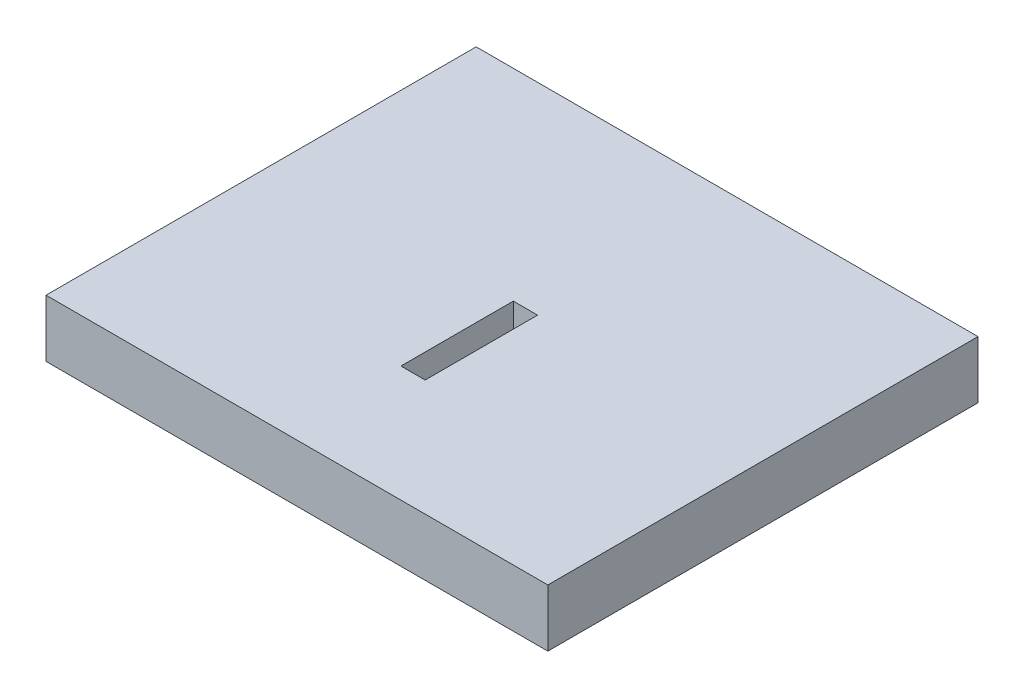
ISO-10303-21;
HEADER;
FILE_DESCRIPTION(('STEP AP214'),'2;1');
FILE_NAME('part.step','',(''),(''),'','','');
FILE_SCHEMA(('AUTOMOTIVE_DESIGN { 1 0 10303 214 1 1 1 1 }'));
ENDSEC;
DATA;
#1=APPLICATION_CONTEXT('core data for automotive mechanical design processes');
#2=APPLICATION_PROTOCOL_DEFINITION('international standard','automotive_design',2000,#1);
#3=PRODUCT_CONTEXT('',#1,'mechanical');
#4=PRODUCT('Part','Part','',(#3));
#5=PRODUCT_RELATED_PRODUCT_CATEGORY('part','',(#4));
#6=PRODUCT_DEFINITION_FORMATION('','',#4);
#7=PRODUCT_DEFINITION_CONTEXT('part definition',#1,'design');
#8=PRODUCT_DEFINITION('design','',#6,#7);
#9=PRODUCT_DEFINITION_SHAPE('','',#8);
#10=(LENGTH_UNIT() NAMED_UNIT(*) SI_UNIT(.MILLI.,.METRE.));
#11=(NAMED_UNIT(*) PLANE_ANGLE_UNIT() SI_UNIT($,.RADIAN.));
#12=(NAMED_UNIT(*) SI_UNIT($,.STERADIAN.) SOLID_ANGLE_UNIT());
#13=UNCERTAINTY_MEASURE_WITH_UNIT(LENGTH_MEASURE(1.E-05),#10,'distance_accuracy_value','');
#14=(GEOMETRIC_REPRESENTATION_CONTEXT(3) GLOBAL_UNCERTAINTY_ASSIGNED_CONTEXT((#13)) GLOBAL_UNIT_ASSIGNED_CONTEXT((#10,
#11,#12)) REPRESENTATION_CONTEXT('',''));
#15=CARTESIAN_POINT('',(0.,0.,0.));
#16=DIRECTION('',(0.,0.,1.));
#17=DIRECTION('',(1.,0.,0.));
#18=AXIS2_PLACEMENT_3D('',#15,#16,#17);
#19=CARTESIAN_POINT('',(0.,4.,0.));
#20=DIRECTION('',(0.,1.,0.));
#21=DIRECTION('',(0.,0.,1.));
#22=AXIS2_PLACEMENT_3D('',#19,#20,#21);
#23=PLANE('',#22);
#24=DIRECTION('',(0.,0.,1.));
#25=VECTOR('',#24,1.);
#26=CARTESIAN_POINT('',(0.,4.,0.));
#27=LINE('',#26,#25);
#28=CARTESIAN_POINT('',(0.,4.,0.));
#29=VERTEX_POINT('',#28);
#30=CARTESIAN_POINT('',(0.,4.,30.));
#31=VERTEX_POINT('',#30);
#32=EDGE_CURVE('E134',#29,#31,#27,.T.);
#33=ORIENTED_EDGE('',*,*,#32,.T.);
#34=DIRECTION('',(1.,0.,0.));
#35=VECTOR('',#34,1.);
#36=CARTESIAN_POINT('',(0.,4.,30.));
#37=LINE('',#36,#35);
#38=CARTESIAN_POINT('',(35.,4.,30.));
#39=VERTEX_POINT('',#38);
#40=EDGE_CURVE('E137',#31,#39,#37,.T.);
#41=ORIENTED_EDGE('',*,*,#40,.T.);
#42=DIRECTION('',(0.,0.,-1.));
#43=VECTOR('',#42,1.);
#44=CARTESIAN_POINT('',(35.,4.,0.));
#45=LINE('',#44,#43);
#46=CARTESIAN_POINT('',(35.,4.,0.));
#47=VERTEX_POINT('',#46);
#48=EDGE_CURVE('E140',#39,#47,#45,.T.);
#49=ORIENTED_EDGE('',*,*,#48,.T.);
#50=DIRECTION('',(-1.,0.,0.));
#51=VECTOR('',#50,1.);
#52=CARTESIAN_POINT('',(0.,4.,0.));
#53=LINE('',#52,#51);
#54=EDGE_CURVE('E142',#47,#29,#53,.T.);
#55=ORIENTED_EDGE('',*,*,#54,.T.);
#56=EDGE_LOOP('',(#33,#41,#49,#55));
#57=FACE_BOUND('',#56,.T.);
#58=DIRECTION('',(-1.,0.,0.));
#59=VECTOR('',#58,1.);
#60=CARTESIAN_POINT('',(16.6540479825426,4.,14.0626183458465));
#61=LINE('',#60,#59);
#62=CARTESIAN_POINT('',(18.3459520174574,4.,14.0626183458465));
#63=VERTEX_POINT('',#62);
#64=CARTESIAN_POINT('',(16.6540479825426,4.,14.0626183458465));
#65=VERTEX_POINT('',#64);
#66=EDGE_CURVE('E106',#63,#65,#61,.T.);
#67=ORIENTED_EDGE('',*,*,#66,.F.);
#68=DIRECTION('',(0.,0.,-1.));
#69=VECTOR('',#68,1.);
#70=CARTESIAN_POINT('',(18.3459520174574,4.,14.0626183458465));
#71=LINE('',#70,#69);
#72=CARTESIAN_POINT('',(18.3459520174574,4.,21.9021994151636));
#73=VERTEX_POINT('',#72);
#74=EDGE_CURVE('E98',#73,#63,#71,.T.);
#75=ORIENTED_EDGE('',*,*,#74,.F.);
#76=DIRECTION('',(1.,0.,0.));
#77=VECTOR('',#76,1.);
#78=CARTESIAN_POINT('',(16.6540479825426,4.,21.9021994151636));
#79=LINE('',#78,#77);
#80=CARTESIAN_POINT('',(16.6540479825426,4.,21.9021994151636));
#81=VERTEX_POINT('',#80);
#82=EDGE_CURVE('E120',#81,#73,#79,.T.);
#83=ORIENTED_EDGE('',*,*,#82,.F.);
#84=DIRECTION('',(0.,0.,1.));
#85=VECTOR('',#84,1.);
#86=CARTESIAN_POINT('',(16.6540479825426,4.,14.0626183458465));
#87=LINE('',#86,#85);
#88=EDGE_CURVE('E118',#65,#81,#87,.T.);
#89=ORIENTED_EDGE('',*,*,#88,.F.);
#90=EDGE_LOOP('',(#67,#75,#83,#89));
#91=FACE_BOUND('',#90,.T.);
#92=ADVANCED_FACE('F33',(#57,#91),#23,.T.);
#93=CARTESIAN_POINT('',(0.,0.,0.));
#94=DIRECTION('',(0.,1.,0.));
#95=DIRECTION('',(0.,0.,1.));
#96=AXIS2_PLACEMENT_3D('',#93,#94,#95);
#97=PLANE('',#96);
#98=DIRECTION('',(0.,0.,1.));
#99=VECTOR('',#98,1.);
#100=CARTESIAN_POINT('',(0.,0.,0.));
#101=LINE('',#100,#99);
#102=CARTESIAN_POINT('',(0.,0.,0.));
#103=VERTEX_POINT('',#102);
#104=CARTESIAN_POINT('',(0.,0.,30.));
#105=VERTEX_POINT('',#104);
#106=EDGE_CURVE('E114',#103,#105,#101,.T.);
#107=ORIENTED_EDGE('',*,*,#106,.F.);
#108=DIRECTION('',(-1.,0.,0.));
#109=VECTOR('',#108,1.);
#110=CARTESIAN_POINT('',(0.,0.,0.));
#111=LINE('',#110,#109);
#112=CARTESIAN_POINT('',(35.,0.,0.));
#113=VERTEX_POINT('',#112);
#114=EDGE_CURVE('E138',#113,#103,#111,.T.);
#115=ORIENTED_EDGE('',*,*,#114,.F.);
#116=DIRECTION('',(0.,0.,-1.));
#117=VECTOR('',#116,1.);
#118=CARTESIAN_POINT('',(35.,0.,0.));
#119=LINE('',#118,#117);
#120=CARTESIAN_POINT('',(35.,0.,30.));
#121=VERTEX_POINT('',#120);
#122=EDGE_CURVE('E149',#121,#113,#119,.T.);
#123=ORIENTED_EDGE('',*,*,#122,.F.);
#124=DIRECTION('',(1.,0.,0.));
#125=VECTOR('',#124,1.);
#126=CARTESIAN_POINT('',(0.,0.,30.));
#127=LINE('',#126,#125);
#128=EDGE_CURVE('E147',#105,#121,#127,.T.);
#129=ORIENTED_EDGE('',*,*,#128,.F.);
#130=EDGE_LOOP('',(#107,#115,#123,#129));
#131=FACE_BOUND('',#130,.T.);
#132=DIRECTION('',(0.,0.,-1.));
#133=VECTOR('',#132,1.);
#134=CARTESIAN_POINT('',(18.3459520174574,0.,14.0626183458465));
#135=LINE('',#134,#133);
#136=CARTESIAN_POINT('',(18.3459520174574,0.,21.9021994151636));
#137=VERTEX_POINT('',#136);
#138=CARTESIAN_POINT('',(18.3459520174574,0.,14.0626183458465));
#139=VERTEX_POINT('',#138);
#140=EDGE_CURVE('E56',#137,#139,#135,.T.);
#141=ORIENTED_EDGE('',*,*,#140,.T.);
#142=DIRECTION('',(-1.,0.,0.));
#143=VECTOR('',#142,1.);
#144=CARTESIAN_POINT('',(16.6540479825426,0.,14.0626183458465));
#145=LINE('',#144,#143);
#146=CARTESIAN_POINT('',(16.6540479825426,0.,14.0626183458465));
#147=VERTEX_POINT('',#146);
#148=EDGE_CURVE('E113',#139,#147,#145,.T.);
#149=ORIENTED_EDGE('',*,*,#148,.T.);
#150=DIRECTION('',(0.,0.,1.));
#151=VECTOR('',#150,1.);
#152=CARTESIAN_POINT('',(16.6540479825426,0.,14.0626183458465));
#153=LINE('',#152,#151);
#154=CARTESIAN_POINT('',(16.6540479825426,0.,21.9021994151636));
#155=VERTEX_POINT('',#154);
#156=EDGE_CURVE('E126',#147,#155,#153,.T.);
#157=ORIENTED_EDGE('',*,*,#156,.T.);
#158=DIRECTION('',(1.,0.,0.));
#159=VECTOR('',#158,1.);
#160=CARTESIAN_POINT('',(16.6540479825426,0.,21.9021994151636));
#161=LINE('',#160,#159);
#162=EDGE_CURVE('E107',#155,#137,#161,.T.);
#163=ORIENTED_EDGE('',*,*,#162,.T.);
#164=EDGE_LOOP('',(#141,#149,#157,#163));
#165=FACE_BOUND('',#164,.T.);
#166=ADVANCED_FACE('F167',(#131,#165),#97,.F.);
#167=CARTESIAN_POINT('',(0.,4.,0.));
#168=DIRECTION('',(1.,0.,0.));
#169=DIRECTION('',(0.,0.,-1.));
#170=AXIS2_PLACEMENT_3D('',#167,#168,#169);
#171=PLANE('',#170);
#172=ORIENTED_EDGE('',*,*,#106,.T.);
#173=DIRECTION('',(0.,-1.,0.));
#174=VECTOR('',#173,1.);
#175=CARTESIAN_POINT('',(0.,4.,30.));
#176=LINE('',#175,#174);
#177=EDGE_CURVE('E11',#31,#105,#176,.T.);
#178=ORIENTED_EDGE('',*,*,#177,.F.);
#179=ORIENTED_EDGE('',*,*,#32,.F.);
#180=DIRECTION('',(0.,-1.,0.));
#181=VECTOR('',#180,1.);
#182=CARTESIAN_POINT('',(0.,4.,0.));
#183=LINE('',#182,#181);
#184=EDGE_CURVE('E144',#29,#103,#183,.T.);
#185=ORIENTED_EDGE('',*,*,#184,.T.);
#186=EDGE_LOOP('',(#172,#178,#179,#185));
#187=FACE_BOUND('',#186,.T.);
#188=ADVANCED_FACE('F35',(#187),#171,.F.);
#189=CARTESIAN_POINT('',(0.,4.,30.));
#190=DIRECTION('',(0.,0.,-1.));
#191=DIRECTION('',(-1.,0.,0.));
#192=AXIS2_PLACEMENT_3D('',#189,#190,#191);
#193=PLANE('',#192);
#194=ORIENTED_EDGE('',*,*,#128,.T.);
#195=DIRECTION('',(0.,-1.,0.));
#196=VECTOR('',#195,1.);
#197=CARTESIAN_POINT('',(35.,4.,30.));
#198=LINE('',#197,#196);
#199=EDGE_CURVE('E41',#39,#121,#198,.T.);
#200=ORIENTED_EDGE('',*,*,#199,.F.);
#201=ORIENTED_EDGE('',*,*,#40,.F.);
#202=ORIENTED_EDGE('',*,*,#177,.T.);
#203=EDGE_LOOP('',(#194,#200,#201,#202));
#204=FACE_BOUND('',#203,.T.);
#205=ADVANCED_FACE('F177',(#204),#193,.F.);
#206=CARTESIAN_POINT('',(35.,4.,0.));
#207=DIRECTION('',(-1.,0.,0.));
#208=DIRECTION('',(0.,0.,1.));
#209=AXIS2_PLACEMENT_3D('',#206,#207,#208);
#210=PLANE('',#209);
#211=ORIENTED_EDGE('',*,*,#122,.T.);
#212=DIRECTION('',(0.,-1.,0.));
#213=VECTOR('',#212,1.);
#214=CARTESIAN_POINT('',(35.,4.,0.));
#215=LINE('',#214,#213);
#216=EDGE_CURVE('E154',#47,#113,#215,.T.);
#217=ORIENTED_EDGE('',*,*,#216,.F.);
#218=ORIENTED_EDGE('',*,*,#48,.F.);
#219=ORIENTED_EDGE('',*,*,#199,.T.);
#220=EDGE_LOOP('',(#211,#217,#218,#219));
#221=FACE_BOUND('',#220,.T.);
#222=ADVANCED_FACE('F161',(#221),#210,.F.);
#223=CARTESIAN_POINT('',(0.,4.,0.));
#224=DIRECTION('',(0.,0.,1.));
#225=DIRECTION('',(1.,0.,0.));
#226=AXIS2_PLACEMENT_3D('',#223,#224,#225);
#227=PLANE('',#226);
#228=ORIENTED_EDGE('',*,*,#114,.T.);
#229=ORIENTED_EDGE('',*,*,#184,.F.);
#230=ORIENTED_EDGE('',*,*,#54,.F.);
#231=ORIENTED_EDGE('',*,*,#216,.T.);
#232=EDGE_LOOP('',(#228,#229,#230,#231));
#233=FACE_BOUND('',#232,.T.);
#234=ADVANCED_FACE('F171',(#233),#227,.F.);
#235=CARTESIAN_POINT('',(18.3459520174574,4.,14.0626183458465));
#236=DIRECTION('',(-1.,0.,0.));
#237=DIRECTION('',(0.,0.,1.));
#238=AXIS2_PLACEMENT_3D('',#235,#236,#237);
#239=PLANE('',#238);
#240=ORIENTED_EDGE('',*,*,#140,.F.);
#241=DIRECTION('',(0.,-1.,0.));
#242=VECTOR('',#241,1.);
#243=CARTESIAN_POINT('',(18.3459520174574,4.,21.9021994151636));
#244=LINE('',#243,#242);
#245=EDGE_CURVE('E102',#73,#137,#244,.T.);
#246=ORIENTED_EDGE('',*,*,#245,.F.);
#247=ORIENTED_EDGE('',*,*,#74,.T.);
#248=DIRECTION('',(0.,-1.,0.));
#249=VECTOR('',#248,1.);
#250=CARTESIAN_POINT('',(18.3459520174574,4.,14.0626183458465));
#251=LINE('',#250,#249);
#252=EDGE_CURVE('E101',#63,#139,#251,.T.);
#253=ORIENTED_EDGE('',*,*,#252,.T.);
#254=EDGE_LOOP('',(#240,#246,#247,#253));
#255=FACE_BOUND('',#254,.T.);
#256=ADVANCED_FACE('F100',(#255),#239,.T.);
#257=CARTESIAN_POINT('',(16.6540479825426,4.,14.0626183458465));
#258=DIRECTION('',(0.,0.,1.));
#259=DIRECTION('',(1.,0.,0.));
#260=AXIS2_PLACEMENT_3D('',#257,#258,#259);
#261=PLANE('',#260);
#262=ORIENTED_EDGE('',*,*,#148,.F.);
#263=ORIENTED_EDGE('',*,*,#252,.F.);
#264=ORIENTED_EDGE('',*,*,#66,.T.);
#265=DIRECTION('',(0.,-1.,0.));
#266=VECTOR('',#265,1.);
#267=CARTESIAN_POINT('',(16.6540479825426,4.,14.0626183458465));
#268=LINE('',#267,#266);
#269=EDGE_CURVE('E115',#65,#147,#268,.T.);
#270=ORIENTED_EDGE('',*,*,#269,.T.);
#271=EDGE_LOOP('',(#262,#263,#264,#270));
#272=FACE_BOUND('',#271,.T.);
#273=ADVANCED_FACE('F110',(#272),#261,.T.);
#274=CARTESIAN_POINT('',(16.6540479825426,4.,14.0626183458465));
#275=DIRECTION('',(1.,0.,0.));
#276=DIRECTION('',(0.,0.,-1.));
#277=AXIS2_PLACEMENT_3D('',#274,#275,#276);
#278=PLANE('',#277);
#279=ORIENTED_EDGE('',*,*,#156,.F.);
#280=ORIENTED_EDGE('',*,*,#269,.F.);
#281=ORIENTED_EDGE('',*,*,#88,.T.);
#282=DIRECTION('',(0.,-1.,0.));
#283=VECTOR('',#282,1.);
#284=CARTESIAN_POINT('',(16.6540479825426,4.,21.9021994151636));
#285=LINE('',#284,#283);
#286=EDGE_CURVE('E48',#81,#155,#285,.T.);
#287=ORIENTED_EDGE('',*,*,#286,.T.);
#288=EDGE_LOOP('',(#279,#280,#281,#287));
#289=FACE_BOUND('',#288,.T.);
#290=ADVANCED_FACE('F200',(#289),#278,.T.);
#291=CARTESIAN_POINT('',(16.6540479825426,4.,21.9021994151636));
#292=DIRECTION('',(0.,0.,-1.));
#293=DIRECTION('',(-1.,0.,0.));
#294=AXIS2_PLACEMENT_3D('',#291,#292,#293);
#295=PLANE('',#294);
#296=ORIENTED_EDGE('',*,*,#162,.F.);
#297=ORIENTED_EDGE('',*,*,#286,.F.);
#298=ORIENTED_EDGE('',*,*,#82,.T.);
#299=ORIENTED_EDGE('',*,*,#245,.T.);
#300=EDGE_LOOP('',(#296,#297,#298,#299));
#301=FACE_BOUND('',#300,.T.);
#302=ADVANCED_FACE('F204',(#301),#295,.T.);
#303=CLOSED_SHELL('',(#92,#166,#188,#205,#222,#234,#256,#273,#290,#302));
#304=MANIFOLD_SOLID_BREP('B2',#303);
#305=ADVANCED_BREP_SHAPE_REPRESENTATION('',(#18,#304),#14);
#306=SHAPE_DEFINITION_REPRESENTATION(#9,#305);
ENDSEC;
END-ISO-10303-21;
